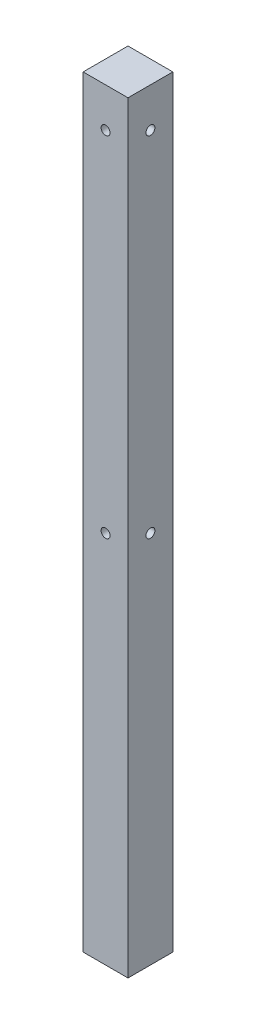
ISO-10303-21;
HEADER;
FILE_DESCRIPTION(('STEP AP214'),'2;1');
FILE_NAME('part.step','',(''),(''),'','','');
FILE_SCHEMA(('AUTOMOTIVE_DESIGN { 1 0 10303 214 1 1 1 1 }'));
ENDSEC;
DATA;
#1=APPLICATION_CONTEXT('core data for automotive mechanical design processes');
#2=APPLICATION_PROTOCOL_DEFINITION('international standard','automotive_design',2000,#1);
#3=PRODUCT_CONTEXT('',#1,'mechanical');
#4=PRODUCT('Part','Part','',(#3));
#5=PRODUCT_RELATED_PRODUCT_CATEGORY('part','',(#4));
#6=PRODUCT_DEFINITION_FORMATION('','',#4);
#7=PRODUCT_DEFINITION_CONTEXT('part definition',#1,'design');
#8=PRODUCT_DEFINITION('design','',#6,#7);
#9=PRODUCT_DEFINITION_SHAPE('','',#8);
#10=(LENGTH_UNIT() NAMED_UNIT(*) SI_UNIT(.MILLI.,.METRE.));
#11=(NAMED_UNIT(*) PLANE_ANGLE_UNIT() SI_UNIT($,.RADIAN.));
#12=(NAMED_UNIT(*) SI_UNIT($,.STERADIAN.) SOLID_ANGLE_UNIT());
#13=UNCERTAINTY_MEASURE_WITH_UNIT(LENGTH_MEASURE(1.E-05),#10,'distance_accuracy_value','');
#14=(GEOMETRIC_REPRESENTATION_CONTEXT(3) GLOBAL_UNCERTAINTY_ASSIGNED_CONTEXT((#13)) GLOBAL_UNIT_ASSIGNED_CONTEXT((#10,
#11,#12)) REPRESENTATION_CONTEXT('',''));
#15=CARTESIAN_POINT('',(0.,0.,0.));
#16=DIRECTION('',(0.,0.,1.));
#17=DIRECTION('',(1.,0.,0.));
#18=AXIS2_PLACEMENT_3D('',#15,#16,#17);
#19=CARTESIAN_POINT('',(50.,834.25,0.));
#20=DIRECTION('',(1.,0.,0.));
#21=DIRECTION('',(0.,0.,-1.));
#22=AXIS2_PLACEMENT_3D('',#19,#20,#21);
#23=CYLINDRICAL_SURFACE('',#22,10.);
#24=CARTESIAN_POINT('',(50.,834.25,0.));
#25=DIRECTION('',(1.,0.,0.));
#26=DIRECTION('',(0.,0.,-1.));
#27=AXIS2_PLACEMENT_3D('',#24,#25,#26);
#28=CIRCLE('',#27,10.);
#29=CARTESIAN_POINT('',(50.,834.25,-10.));
#30=VERTEX_POINT('',#29);
#31=EDGE_CURVE('E120',#30,#30,#28,.T.);
#32=ORIENTED_EDGE('',*,*,#31,.T.);
#33=EDGE_LOOP('',(#32));
#34=FACE_BOUND('',#33,.T.);
#35=CARTESIAN_POINT('',(0.,834.25,0.));
#36=DIRECTION('',(0.707106781186547,0.,-0.707106781186548));
#37=DIRECTION('',(0.707106781186548,0.,0.707106781186547));
#38=AXIS2_PLACEMENT_3D('',#35,#36,#37);
#39=ELLIPSE('',#38,14.1421356237309,9.99999999999999);
#40=CARTESIAN_POINT('',(0.,824.25,0.));
#41=VERTEX_POINT('',#40);
#42=CARTESIAN_POINT('',(0.,844.25,0.));
#43=VERTEX_POINT('',#42);
#44=EDGE_CURVE('E52',#41,#43,#39,.F.);
#45=ORIENTED_EDGE('',*,*,#44,.T.);
#46=CARTESIAN_POINT('',(0.,834.25,0.));
#47=DIRECTION('',(0.707106781186548,0.,0.707106781186547));
#48=DIRECTION('',(0.707106781186547,0.,-0.707106781186548));
#49=AXIS2_PLACEMENT_3D('',#46,#47,#48);
#50=ELLIPSE('',#49,14.1421356237309,9.99999999999999);
#51=EDGE_CURVE('E11',#43,#41,#50,.F.);
#52=ORIENTED_EDGE('',*,*,#51,.T.);
#53=EDGE_LOOP('',(#45,#52));
#54=FACE_BOUND('',#53,.T.);
#55=ADVANCED_FACE('F38',(#34,#54),#23,.F.);
#56=CARTESIAN_POINT('',(50.,1700.,-50.));
#57=DIRECTION('',(-1.,0.,0.));
#58=DIRECTION('',(0.,0.,1.));
#59=AXIS2_PLACEMENT_3D('',#56,#57,#58);
#60=PLANE('',#59);
#61=ORIENTED_EDGE('',*,*,#31,.F.);
#62=EDGE_LOOP('',(#61));
#63=FACE_BOUND('',#62,.T.);
#64=CARTESIAN_POINT('',(50.,1612.27548360223,0.));
#65=DIRECTION('',(1.,0.,0.));
#66=DIRECTION('',(0.,0.,-1.));
#67=AXIS2_PLACEMENT_3D('',#64,#65,#66);
#68=CIRCLE('',#67,10.);
#69=CARTESIAN_POINT('',(50.,1612.27548360223,-10.));
#70=VERTEX_POINT('',#69);
#71=EDGE_CURVE('E155',#70,#70,#68,.T.);
#72=ORIENTED_EDGE('',*,*,#71,.F.);
#73=EDGE_LOOP('',(#72));
#74=FACE_BOUND('',#73,.T.);
#75=DIRECTION('',(0.,0.,-1.));
#76=VECTOR('',#75,1.);
#77=CARTESIAN_POINT('',(50.,0.,-50.));
#78=LINE('',#77,#76);
#79=CARTESIAN_POINT('',(50.,0.,50.));
#80=VERTEX_POINT('',#79);
#81=CARTESIAN_POINT('',(50.,0.,-50.));
#82=VERTEX_POINT('',#81);
#83=EDGE_CURVE('E167',#80,#82,#78,.T.);
#84=ORIENTED_EDGE('',*,*,#83,.T.);
#85=DIRECTION('',(0.,-1.,0.));
#86=VECTOR('',#85,1.);
#87=CARTESIAN_POINT('',(50.,1700.,-50.));
#88=LINE('',#87,#86);
#89=CARTESIAN_POINT('',(50.,1700.,-50.));
#90=VERTEX_POINT('',#89);
#91=EDGE_CURVE('E105',#90,#82,#88,.T.);
#92=ORIENTED_EDGE('',*,*,#91,.F.);
#93=DIRECTION('',(0.,0.,-1.));
#94=VECTOR('',#93,1.);
#95=CARTESIAN_POINT('',(50.,1700.,-50.));
#96=LINE('',#95,#94);
#97=CARTESIAN_POINT('',(50.,1700.,50.));
#98=VERTEX_POINT('',#97);
#99=EDGE_CURVE('E168',#98,#90,#96,.T.);
#100=ORIENTED_EDGE('',*,*,#99,.F.);
#101=DIRECTION('',(0.,-1.,0.));
#102=VECTOR('',#101,1.);
#103=CARTESIAN_POINT('',(50.,1700.,50.));
#104=LINE('',#103,#102);
#105=EDGE_CURVE('E178',#98,#80,#104,.T.);
#106=ORIENTED_EDGE('',*,*,#105,.T.);
#107=EDGE_LOOP('',(#84,#92,#100,#106));
#108=FACE_BOUND('',#107,.T.);
#109=ADVANCED_FACE('F40',(#63,#74,#108),#60,.F.);
#110=CARTESIAN_POINT('',(-50.,1700.,-50.));
#111=DIRECTION('',(0.,0.,1.));
#112=DIRECTION('',(1.,0.,0.));
#113=AXIS2_PLACEMENT_3D('',#110,#111,#112);
#114=PLANE('',#113);
#115=CARTESIAN_POINT('',(0.,834.25,-50.));
#116=DIRECTION('',(0.,0.,1.));
#117=DIRECTION('',(1.,0.,0.));
#118=AXIS2_PLACEMENT_3D('',#115,#116,#117);
#119=CIRCLE('',#118,9.99999999999998);
#120=CARTESIAN_POINT('',(9.99999999999998,834.25,-50.));
#121=VERTEX_POINT('',#120);
#122=EDGE_CURVE('E227',#121,#121,#119,.T.);
#123=ORIENTED_EDGE('',*,*,#122,.T.);
#124=EDGE_LOOP('',(#123));
#125=FACE_BOUND('',#124,.T.);
#126=CARTESIAN_POINT('',(0.,1612.28,-50.));
#127=DIRECTION('',(0.,0.,1.));
#128=DIRECTION('',(1.,0.,0.));
#129=AXIS2_PLACEMENT_3D('',#126,#127,#128);
#130=CIRCLE('',#129,9.99999999999998);
#131=CARTESIAN_POINT('',(9.99999999999998,1612.28,-50.));
#132=VERTEX_POINT('',#131);
#133=EDGE_CURVE('E121',#132,#132,#130,.T.);
#134=ORIENTED_EDGE('',*,*,#133,.T.);
#135=EDGE_LOOP('',(#134));
#136=FACE_BOUND('',#135,.T.);
#137=DIRECTION('',(-1.,0.,0.));
#138=VECTOR('',#137,1.);
#139=CARTESIAN_POINT('',(-50.,0.,-50.));
#140=LINE('',#139,#138);
#141=CARTESIAN_POINT('',(-50.,0.,-50.));
#142=VERTEX_POINT('',#141);
#143=EDGE_CURVE('E182',#82,#142,#140,.T.);
#144=ORIENTED_EDGE('',*,*,#143,.T.);
#145=DIRECTION('',(0.,-1.,0.));
#146=VECTOR('',#145,1.);
#147=CARTESIAN_POINT('',(-50.,1700.,-50.));
#148=LINE('',#147,#146);
#149=CARTESIAN_POINT('',(-50.,1700.,-50.));
#150=VERTEX_POINT('',#149);
#151=EDGE_CURVE('E194',#150,#142,#148,.T.);
#152=ORIENTED_EDGE('',*,*,#151,.F.);
#153=DIRECTION('',(-1.,0.,0.));
#154=VECTOR('',#153,1.);
#155=CARTESIAN_POINT('',(-50.,1700.,-50.));
#156=LINE('',#155,#154);
#157=EDGE_CURVE('E90',#90,#150,#156,.T.);
#158=ORIENTED_EDGE('',*,*,#157,.F.);
#159=ORIENTED_EDGE('',*,*,#91,.T.);
#160=EDGE_LOOP('',(#144,#152,#158,#159));
#161=FACE_BOUND('',#160,.T.);
#162=ADVANCED_FACE('F146',(#125,#136,#161),#114,.F.);
#163=CARTESIAN_POINT('',(-50.,1700.,-50.));
#164=DIRECTION('',(1.,0.,0.));
#165=DIRECTION('',(0.,0.,-1.));
#166=AXIS2_PLACEMENT_3D('',#163,#164,#165);
#167=PLANE('',#166);
#168=CARTESIAN_POINT('',(-50.,834.25,0.));
#169=DIRECTION('',(1.,0.,0.));
#170=DIRECTION('',(0.,0.,-1.));
#171=AXIS2_PLACEMENT_3D('',#168,#169,#170);
#172=CIRCLE('',#171,10.);
#173=CARTESIAN_POINT('',(-50.,834.25,-10.));
#174=VERTEX_POINT('',#173);
#175=EDGE_CURVE('E151',#174,#174,#172,.T.);
#176=ORIENTED_EDGE('',*,*,#175,.T.);
#177=EDGE_LOOP('',(#176));
#178=FACE_BOUND('',#177,.T.);
#179=CARTESIAN_POINT('',(-50.,1612.27548360223,0.));
#180=DIRECTION('',(1.,0.,0.));
#181=DIRECTION('',(0.,0.,-1.));
#182=AXIS2_PLACEMENT_3D('',#179,#180,#181);
#183=CIRCLE('',#182,10.);
#184=CARTESIAN_POINT('',(-50.,1612.27548360223,-10.));
#185=VERTEX_POINT('',#184);
#186=EDGE_CURVE('E163',#185,#185,#183,.T.);
#187=ORIENTED_EDGE('',*,*,#186,.T.);
#188=EDGE_LOOP('',(#187));
#189=FACE_BOUND('',#188,.T.);
#190=DIRECTION('',(0.,0.,1.));
#191=VECTOR('',#190,1.);
#192=CARTESIAN_POINT('',(-50.,0.,-50.));
#193=LINE('',#192,#191);
#194=CARTESIAN_POINT('',(-50.,0.,50.));
#195=VERTEX_POINT('',#194);
#196=EDGE_CURVE('E185',#142,#195,#193,.T.);
#197=ORIENTED_EDGE('',*,*,#196,.T.);
#198=DIRECTION('',(0.,-1.,0.));
#199=VECTOR('',#198,1.);
#200=CARTESIAN_POINT('',(-50.,1700.,50.));
#201=LINE('',#200,#199);
#202=CARTESIAN_POINT('',(-50.,1700.,50.));
#203=VERTEX_POINT('',#202);
#204=EDGE_CURVE('E192',#203,#195,#201,.T.);
#205=ORIENTED_EDGE('',*,*,#204,.F.);
#206=DIRECTION('',(0.,0.,1.));
#207=VECTOR('',#206,1.);
#208=CARTESIAN_POINT('',(-50.,1700.,-50.));
#209=LINE('',#208,#207);
#210=EDGE_CURVE('E173',#150,#203,#209,.T.);
#211=ORIENTED_EDGE('',*,*,#210,.F.);
#212=ORIENTED_EDGE('',*,*,#151,.T.);
#213=EDGE_LOOP('',(#197,#205,#211,#212));
#214=FACE_BOUND('',#213,.T.);
#215=ADVANCED_FACE('F207',(#178,#189,#214),#167,.F.);
#216=CARTESIAN_POINT('',(-50.,1700.,50.));
#217=DIRECTION('',(0.,0.,-1.));
#218=DIRECTION('',(-1.,0.,0.));
#219=AXIS2_PLACEMENT_3D('',#216,#217,#218);
#220=PLANE('',#219);
#221=CARTESIAN_POINT('',(0.,834.25,50.));
#222=DIRECTION('',(0.,0.,1.));
#223=DIRECTION('',(1.,0.,0.));
#224=AXIS2_PLACEMENT_3D('',#221,#222,#223);
#225=CIRCLE('',#224,9.99999999999999);
#226=CARTESIAN_POINT('',(9.99999999999999,834.25,50.));
#227=VERTEX_POINT('',#226);
#228=EDGE_CURVE('E237',#227,#227,#225,.T.);
#229=ORIENTED_EDGE('',*,*,#228,.F.);
#230=EDGE_LOOP('',(#229));
#231=FACE_BOUND('',#230,.T.);
#232=CARTESIAN_POINT('',(0.,1612.28,50.));
#233=DIRECTION('',(0.,0.,1.));
#234=DIRECTION('',(1.,0.,0.));
#235=AXIS2_PLACEMENT_3D('',#232,#233,#234);
#236=CIRCLE('',#235,9.99999999999999);
#237=CARTESIAN_POINT('',(9.99999999999999,1612.28,50.));
#238=VERTEX_POINT('',#237);
#239=EDGE_CURVE('E232',#238,#238,#236,.T.);
#240=ORIENTED_EDGE('',*,*,#239,.F.);
#241=EDGE_LOOP('',(#240));
#242=FACE_BOUND('',#241,.T.);
#243=DIRECTION('',(1.,0.,0.));
#244=VECTOR('',#243,1.);
#245=CARTESIAN_POINT('',(-50.,0.,50.));
#246=LINE('',#245,#244);
#247=EDGE_CURVE('E82',#195,#80,#246,.T.);
#248=ORIENTED_EDGE('',*,*,#247,.T.);
#249=ORIENTED_EDGE('',*,*,#105,.F.);
#250=DIRECTION('',(1.,0.,0.));
#251=VECTOR('',#250,1.);
#252=CARTESIAN_POINT('',(-50.,1700.,50.));
#253=LINE('',#252,#251);
#254=EDGE_CURVE('E61',#203,#98,#253,.T.);
#255=ORIENTED_EDGE('',*,*,#254,.F.);
#256=ORIENTED_EDGE('',*,*,#204,.T.);
#257=EDGE_LOOP('',(#248,#249,#255,#256));
#258=FACE_BOUND('',#257,.T.);
#259=ADVANCED_FACE('F208',(#231,#242,#258),#220,.F.);
#260=CARTESIAN_POINT('',(0.,1700.,0.));
#261=DIRECTION('',(0.,1.,0.));
#262=DIRECTION('',(0.,0.,1.));
#263=AXIS2_PLACEMENT_3D('',#260,#261,#262);
#264=PLANE('',#263);
#265=ORIENTED_EDGE('',*,*,#99,.T.);
#266=ORIENTED_EDGE('',*,*,#157,.T.);
#267=ORIENTED_EDGE('',*,*,#210,.T.);
#268=ORIENTED_EDGE('',*,*,#254,.T.);
#269=EDGE_LOOP('',(#265,#266,#267,#268));
#270=FACE_BOUND('',#269,.T.);
#271=ADVANCED_FACE('F209',(#270),#264,.T.);
#272=CARTESIAN_POINT('',(0.,0.,0.));
#273=DIRECTION('',(0.,1.,0.));
#274=DIRECTION('',(0.,0.,1.));
#275=AXIS2_PLACEMENT_3D('',#272,#273,#274);
#276=PLANE('',#275);
#277=ORIENTED_EDGE('',*,*,#83,.F.);
#278=ORIENTED_EDGE('',*,*,#247,.F.);
#279=ORIENTED_EDGE('',*,*,#196,.F.);
#280=ORIENTED_EDGE('',*,*,#143,.F.);
#281=EDGE_LOOP('',(#277,#278,#279,#280));
#282=FACE_BOUND('',#281,.T.);
#283=ADVANCED_FACE('F137',(#282),#276,.F.);
#284=CARTESIAN_POINT('',(50.,1612.27548360223,0.));
#285=DIRECTION('',(1.,0.,0.));
#286=DIRECTION('',(0.,0.,-1.));
#287=AXIS2_PLACEMENT_3D('',#284,#285,#286);
#288=CYLINDRICAL_SURFACE('',#287,10.);
#289=CARTESIAN_POINT('',(-9.99999898010749,1612.27548360223,-10.));
#290=CARTESIAN_POINT('',(-10.0000976262313,1612.49846189064,-9.99999794013743));
#291=CARTESIAN_POINT('',(-9.99272659014063,1612.72147800719,-9.99252618315263));
#292=CARTESIAN_POINT('',(-9.96319930527727,1613.16555690865,-9.96279699343112));
#293=CARTESIAN_POINT('',(-9.94103997156247,1613.38661927624,-9.94053647566002));
#294=CARTESIAN_POINT('',(-9.88239130180325,1613.82509198013,-9.88168441724928));
#295=CARTESIAN_POINT('',(-9.84588935796274,1614.04249892732,-9.84508026799295));
#296=CARTESIAN_POINT('',(-9.75930246880813,1614.47179664017,-9.75828751120326));
#297=CARTESIAN_POINT('',(-9.70921788194251,1614.68368755123,-9.7080992621569));
#298=CARTESIAN_POINT('',(-9.59679719660233,1615.09912624717,-9.59546992605019));
#299=CARTESIAN_POINT('',(-9.53454955789336,1615.30272215291,-9.53311731317229));
#300=CARTESIAN_POINT('',(-9.39858242327569,1615.70216057657,-9.39693747832633));
#301=CARTESIAN_POINT('',(-9.32485861899744,1615.89800014785,-9.32310594696796));
#302=CARTESIAN_POINT('',(-9.16702899669798,1616.2810609764,-9.16505737869574));
#303=CARTESIAN_POINT('',(-9.08292441163676,1616.46828325356,-9.0808415751577));
#304=CARTESIAN_POINT('',(-8.90536571570071,1616.8336512179,-8.90305599741039));
#305=CARTESIAN_POINT('',(-8.81190942608959,1617.01179477529,-8.80948404343291));
#306=CARTESIAN_POINT('',(-8.57672115449208,1617.42960891938,-8.57401049506819));
#307=CARTESIAN_POINT('',(-8.43087296801772,1617.66465869959,-8.42798997281269));
#308=CARTESIAN_POINT('',(-8.12520554019687,1618.11569176011,-8.12196325116366));
#309=CARTESIAN_POINT('',(-7.96538497984856,1618.33167323649,-7.96195573138801));
#310=CARTESIAN_POINT('',(-7.63362996184256,1618.74514477614,-7.62980689666286));
#311=CARTESIAN_POINT('',(-7.46166965268203,1618.94259315647,-7.45763968738279));
#312=CARTESIAN_POINT('',(-7.1078863681561,1619.31879499788,-7.10341650293182));
#313=CARTESIAN_POINT('',(-6.92606337313864,1619.49754842171,-6.92136050805685));
#314=CARTESIAN_POINT('',(-6.48219548609604,1619.90253540879,-6.47689474013113));
#315=CARTESIAN_POINT('',(-6.21632599750444,1620.1203873417,-6.21064422051454));
#316=CARTESIAN_POINT('',(-5.67222173105225,1620.52259848029,-5.66567410042851));
#317=CARTESIAN_POINT('',(-5.39398115613774,1620.7069417736,-5.38694865383075));
#318=CARTESIAN_POINT('',(-4.82830370696799,1621.04331396219,-4.82013095297611));
#319=CARTESIAN_POINT('',(-4.54087437268702,1621.19536860715,-4.53204637549684));
#320=CARTESIAN_POINT('',(-3.95907397006877,1621.46852263777,-3.94863654080369));
#321=CARTESIAN_POINT('',(-3.66470616059586,1621.5896362514,-3.65331468030931));
#322=CARTESIAN_POINT('',(-3.19058993886652,1621.75921813269,-3.17718250685674));
#323=CARTESIAN_POINT('',(-3.01242259348861,1621.81729971615,-2.99815141821699));
#324=CARTESIAN_POINT('',(-2.65489416100799,1621.92293805164,-2.63850497469348));
#325=CARTESIAN_POINT('',(-2.4755342555538,1621.97050397338,-2.4578911440147));
#326=CARTESIAN_POINT('',(-2.01860406285901,1622.07828022694,-1.99692163906074));
#327=CARTESIAN_POINT('',(-1.74042530447089,1622.13139816118,-1.71549592179029));
#328=CARTESIAN_POINT('',(-1.27003976504966,1622.20092299369,-1.23503528762237));
#329=CARTESIAN_POINT('',(-1.07759452180368,1622.22359078185,-1.03716319502614));
#330=CARTESIAN_POINT('',(-0.777707315706295,1622.25032830782,-0.718652779837108));
#331=CARTESIAN_POINT('',(-0.668232008471103,1622.25821195121,-0.600156335958622));
#332=CARTESIAN_POINT('',(-0.5045256733269,1622.26743235312,-0.40732126508171));
#333=CARTESIAN_POINT('',(-0.446999986192739,1622.27012505736,-0.336227608652713));
#334=CARTESIAN_POINT('',(-0.382349562133267,1622.27269996116,-0.236995791411632));
#335=CARTESIAN_POINT('',(-0.368163303243749,1622.27322908345,-0.213683879316501));
#336=CARTESIAN_POINT('',(-0.342480250799768,1622.2741415731,-0.165590387121098));
#337=CARTESIAN_POINT('',(-0.330978679941623,1622.27452520013,-0.140811517491331));
#338=CARTESIAN_POINT('',(-0.315533077710255,1622.27502278996,-0.0975862630469684));
#339=CARTESIAN_POINT('',(-0.310349776656142,1622.27518362162,-0.0796005428850992));
#340=CARTESIAN_POINT('',(-0.303054495672547,1622.27540754589,-0.0430426481303628));
#341=CARTESIAN_POINT('',(-0.300931818517807,1622.27547097895,-0.0244727490578558));
#342=CARTESIAN_POINT('',(-0.300205103632165,1622.27549283978,0.0128350455574307));
#343=CARTESIAN_POINT('',(-0.301618926177544,1622.27545073454,0.0315733156969989));
#344=CARTESIAN_POINT('',(-0.307681650307432,1622.27526593112,0.0685341168406336));
#345=CARTESIAN_POINT('',(-0.312339174277956,1622.27512296482,0.0867551382292879));
#346=CARTESIAN_POINT('',(-0.330226423679226,1622.27455282091,0.14132713099595));
#347=CARTESIAN_POINT('',(-0.347304514003391,1622.27398508943,0.176345156634737));
#348=CARTESIAN_POINT('',(-0.386000914119675,1622.27256697517,0.243876461094534));
#349=CARTESIAN_POINT('',(-0.407661303739916,1622.27171392689,0.276362416057307));
#350=CARTESIAN_POINT('',(-0.479584403526916,1622.26861279862,0.377026305142638));
#351=CARTESIAN_POINT('',(-0.533632241502456,1622.26590105046,0.442441471468532));
#352=CARTESIAN_POINT('',(-0.644385525613811,1622.25937567054,0.570948416913729));
#353=CARTESIAN_POINT('',(-0.701096651157631,1622.25555958526,0.634034666065601));
#354=CARTESIAN_POINT('',(-0.815623950613769,1622.24684645673,0.758835860242758));
#355=CARTESIAN_POINT('',(-0.873436596559627,1622.24195246172,0.820554142600376));
#356=CARTESIAN_POINT('',(-0.989588148243909,1622.2310869539,0.943259578966304));
#357=CARTESIAN_POINT('',(-1.047926454643,1622.22511654932,1.00424741677271));
#358=CARTESIAN_POINT('',(-1.34049086181197,1622.19253934096,1.3084546681925));
#359=CARTESIAN_POINT('',(-1.57677676729038,1622.15780572178,1.54888879699003));
#360=CARTESIAN_POINT('',(-2.04881458072232,1622.07082635501,2.02735292584259));
#361=CARTESIAN_POINT('',(-2.28456604711146,1622.01856935082,2.26538127897832));
#362=CARTESIAN_POINT('',(-2.75474046965051,1621.89615590566,2.73910416561247));
#363=CARTESIAN_POINT('',(-2.98915997987742,1621.82596508381,2.97479330276211));
#364=CARTESIAN_POINT('',(-3.45508765041959,1621.66738307423,3.442854538514));
#365=CARTESIAN_POINT('',(-3.6865960425948,1621.57899334585,3.67522690148696));
#366=CARTESIAN_POINT('',(-4.2180867074266,1621.3527828871,4.20843204456885));
#367=CARTESIAN_POINT('',(-4.51668870182465,1621.2081600997,4.50779473567366));
#368=CARTESIAN_POINT('',(-5.10495915239884,1620.88534760951,5.09737432304827));
#369=CARTESIAN_POINT('',(-5.39462442907102,1620.70714611677,5.38758796505439));
#370=CARTESIAN_POINT('',(-5.96157341823173,1620.31604830854,5.9555037920929));
#371=CARTESIAN_POINT('',(-6.23887587965501,1620.10320697655,6.23322492890681));
#372=CARTESIAN_POINT('',(-6.7778734042662,1619.6411348992,6.7729799836624));
#373=CARTESIAN_POINT('',(-7.03957861400702,1619.39192818288,7.03502410048182));
#374=CARTESIAN_POINT('',(-7.447999978436,1618.95680902953,7.44395283208073));
#375=CARTESIAN_POINT('',(-7.60088569894206,1618.78243206285,7.59702311774558));
#376=CARTESIAN_POINT('',(-7.89758136950345,1618.41867226101,7.89407209398891));
#377=CARTESIAN_POINT('',(-8.0413893635554,1618.22928621149,8.03804882515728));
#378=CARTESIAN_POINT('',(-8.31819326574946,1617.83567168758,8.31517771730908));
#379=CARTESIAN_POINT('',(-8.45120076104004,1617.63145957696,8.44834147881699));
#380=CARTESIAN_POINT('',(-8.70478005071714,1617.2082448175,8.70222373304095));
#381=CARTESIAN_POINT('',(-8.82535917551048,1616.9892510147,8.82294956178477));
#382=CARTESIAN_POINT('',(-9.03195880469565,1616.57731515247,9.02980977550291));
#383=CARTESIAN_POINT('',(-9.12030516891076,1616.38670620783,9.11827120280942));
#384=CARTESIAN_POINT('',(-9.28619480862073,1615.99638516328,9.28438705793998));
#385=CARTESIAN_POINT('',(-9.36374333754312,1615.79667755333,9.36204674107351));
#386=CARTESIAN_POINT('',(-9.50691793527382,1615.38888982838,9.50544065111092));
#387=CARTESIAN_POINT('',(-9.57254571311982,1615.18081091877,9.57117658748008));
#388=CARTESIAN_POINT('',(-9.69077415874732,1614.75734001943,9.68961912347007));
#389=CARTESIAN_POINT('',(-9.74337472258719,1614.54194797136,9.74232561913152));
#390=CARTESIAN_POINT('',(-9.83487435290641,1614.10365672146,9.83403631069547));
#391=CARTESIAN_POINT('',(-9.87366943255299,1613.88071384656,9.87293650807316));
#392=CARTESIAN_POINT('',(-9.93618177528338,1613.4306122198,9.93565806482951));
#393=CARTESIAN_POINT('',(-9.95989897438512,1613.20345345004,9.95947936022176));
#394=CARTESIAN_POINT('',(-9.99170534241536,1612.74704474546,9.99149337418261));
#395=CARTESIAN_POINT('',(-9.99980142826941,1612.51779578136,9.99969300989846));
#396=CARTESIAN_POINT('',(-10.0001912850112,1612.0592767474,10.0002899529583));
#397=CARTESIAN_POINT('',(-9.99248659612656,1611.83000668177,9.99268880053026));
#398=CARTESIAN_POINT('',(-9.96331764763798,1611.40085270239,9.96371501100188));
#399=CARTESIAN_POINT('',(-9.94360474420379,1611.20072640085,9.94409367767468));
#400=CARTESIAN_POINT('',(-9.89241540177043,1610.80343620806,9.89308823794108));
#401=CARTESIAN_POINT('',(-9.86093514652222,1610.60627329946,9.86170031552349));
#402=CARTESIAN_POINT('',(-9.78675158362025,1610.21629360291,9.78770250475261));
#403=CARTESIAN_POINT('',(-9.7440518175343,1610.02347546431,9.74509615761541));
#404=CARTESIAN_POINT('',(-9.64807232934185,1609.64310844002,9.64930509095488));
#405=CARTESIAN_POINT('',(-9.59478841021848,1609.45556167842,9.59611617502915));
#406=CARTESIAN_POINT('',(-9.47634220157274,1609.08015220424,9.4778654097417));
#407=CARTESIAN_POINT('',(-9.41082689822712,1608.89251220425,9.41245062008271));
#408=CARTESIAN_POINT('',(-9.27015225784029,1608.52458797839,9.2719798327068));
#409=CARTESIAN_POINT('',(-9.19498983478881,1608.34430613075,9.19692074987543));
#410=CARTESIAN_POINT('',(-8.95634508373009,1607.81532180425,8.95859132443324));
#411=CARTESIAN_POINT('',(-8.77965647541379,1607.47832929096,8.78212008363375));
#412=CARTESIAN_POINT('',(-8.44239554179759,1606.91268668253,8.44526213721896));
#413=CARTESIAN_POINT('',(-8.2875682785034,1606.67702047312,8.29061618684285));
#414=CARTESIAN_POINT('',(-7.96386119885567,1606.22574829809,7.96728875931998));
#415=CARTESIAN_POINT('',(-7.79497912766116,1606.01014556309,7.7986050300644));
#416=CARTESIAN_POINT('',(-7.44506553712989,1605.59836651861,7.44911139163631));
#417=CARTESIAN_POINT('',(-7.26400360127196,1605.40224211989,7.26827112503926));
#418=CARTESIAN_POINT('',(-6.89209397706146,1605.02959800866,6.89683567352615));
#419=CARTESIAN_POINT('',(-6.70124648299855,1604.85307790712,6.70624068228772));
#420=CARTESIAN_POINT('',(-6.23639673381204,1604.45480253995,6.2420430895615));
#421=CARTESIAN_POINT('',(-5.95864028448772,1604.24175663634,5.96470554041767));
#422=CARTESIAN_POINT('',(-5.39098777874865,1603.8505190864,5.39801749366647));
#423=CARTESIAN_POINT('',(-5.1010859330967,1603.67234429663,5.10866126780038));
#424=CARTESIAN_POINT('',(-4.51244534009281,1603.34969639509,4.52133019330866));
#425=CARTESIAN_POINT('',(-4.21371936943252,1603.20517701205,4.22336781843389));
#426=CARTESIAN_POINT('',(-3.6093891910763,1602.94833031627,3.62095944184495));
#427=CARTESIAN_POINT('',(-3.30378844675537,1602.83598716884,3.31651670878845));
#428=CARTESIAN_POINT('',(-2.83293356937604,1602.68815304994,2.84813442614206));
#429=CARTESIAN_POINT('',(-2.6695660359803,1602.64142542465,2.68574918934028));
#430=CARTESIAN_POINT('',(-2.34145444140422,1602.5565066646,2.36004428910267));
#431=CARTESIAN_POINT('',(-2.17671008227217,1602.51831742996,2.19672442595338));
#432=CARTESIAN_POINT('',(-1.88186842571719,1602.45777873915,1.90519444907107));
#433=CARTESIAN_POINT('',(-1.75202149121331,1602.43379056885,1.7770668908385));
#434=CARTESIAN_POINT('',(-1.49179935367538,1602.39102191311,1.52123875350964));
#435=CARTESIAN_POINT('',(-1.3614267899981,1602.37222646642,1.39353801753157));
#436=CARTESIAN_POINT('',(-1.1451870559631,1602.34541890019,1.1835443481069));
#437=CARTESIAN_POINT('',(-1.05972712320779,1602.33593574398,1.10101471080627));
#438=CARTESIAN_POINT('',(-0.887034665432671,1602.31903676075,0.93599166272438));
#439=CARTESIAN_POINT('',(-0.799793073011311,1602.31164067725,0.853505516149334));
#440=CARTESIAN_POINT('',(-0.66679609577937,1602.30215550139,0.731051561337179));
#441=CARTESIAN_POINT('',(-0.621868821897721,1602.2992511089,0.690237366501271));
#442=CARTESIAN_POINT('',(-0.530778614646921,1602.29399141888,0.609464771903338));
#443=CARTESIAN_POINT('',(-0.484610762195775,1602.29163884048,0.569511456145537));
#444=CARTESIAN_POINT('',(-0.39129737953422,1602.2875507373,0.492608384630434));
#445=CARTESIAN_POINT('',(-0.34418384331868,1602.28580498178,0.45561784633972));
#446=CARTESIAN_POINT('',(-0.246313377859504,1602.28291410021,0.386855669777941));
#447=CARTESIAN_POINT('',(-0.195601699936697,1602.28176264185,0.355031596307034));
#448=CARTESIAN_POINT('',(-0.130029381683837,1602.28083968234,0.327292066360918));
#449=CARTESIAN_POINT('',(-0.118932246904419,1602.28070103509,0.32301343261752));
#450=CARTESIAN_POINT('',(-0.0964169231301864,1602.28045838007,0.31541006559586));
#451=CARTESIAN_POINT('',(-0.0849986560181496,1602.28035438081,0.312085566658807));
#452=CARTESIAN_POINT('',(-0.0505538672441254,1602.28010195769,0.303938994783873));
#453=CARTESIAN_POINT('',(-0.0270681230938875,1602.28000914857,0.300819166693194));
#454=CARTESIAN_POINT('',(0.0163924674815784,1602.2799934067,0.300290551954016));
#455=CARTESIAN_POINT('',(0.0363606578526443,1602.2800468873,0.302088802735881));
#456=CARTESIAN_POINT('',(0.075743233039318,1602.28026729643,0.309296415830664));
#457=CARTESIAN_POINT('',(0.095152350337865,1602.28043507161,0.314732721528388));
#458=CARTESIAN_POINT('',(0.154323048880429,1602.28110926361,0.335663034437154));
#459=CARTESIAN_POINT('',(0.192413959605159,1602.28178430762,0.355591395683952));
#460=CARTESIAN_POINT('',(0.265766396185627,1602.28346461193,0.400097028042301));
#461=CARTESIAN_POINT('',(0.301003762506442,1602.28447238561,0.424709060128776));
#462=CARTESIAN_POINT('',(0.411441332337627,1602.28817712498,0.506803364386609));
#463=CARTESIAN_POINT('',(0.483691858622577,1602.29144725114,0.568192651458751));
#464=CARTESIAN_POINT('',(0.625903139030583,1602.29935650477,0.693502856119578));
#465=CARTESIAN_POINT('',(0.695859066516355,1602.30399833513,0.757428554226694));
#466=CARTESIAN_POINT('',(0.834390844029621,1602.31462921491,0.886297723348133));
#467=CARTESIAN_POINT('',(0.902970101922903,1602.32061432686,0.951237713792392));
#468=CARTESIAN_POINT('',(1.03941477235458,1602.33393061604,1.0815881905224));
#469=CARTESIAN_POINT('',(1.10728075191473,1602.34126062249,1.14699822039883));
#470=CARTESIAN_POINT('',(1.44679507730305,1602.38142197951,1.47570639974943));
#471=CARTESIAN_POINT('',(1.71563126213154,1602.424481262,1.74075934203922));
#472=CARTESIAN_POINT('',(2.2503605156383,1602.53268963391,2.26962052301318));
#473=CARTESIAN_POINT('',(2.51625152837471,1602.59785325966,2.53342782648594));
#474=CARTESIAN_POINT('',(3.04476725354704,1602.75082011912,3.05870162153385));
#475=CARTESIAN_POINT('',(3.30738574390949,1602.83866111848,3.32016344820291));
#476=CARTESIAN_POINT('',(3.82797449444239,1603.0374786197,3.83880429105766));
#477=CARTESIAN_POINT('',(4.08594563245672,1603.14845070146,4.09598411536537));
#478=CARTESIAN_POINT('',(4.59717239824727,1603.39479423766,4.6058513415177));
#479=CARTESIAN_POINT('',(4.85040210535581,1603.53027149747,4.85851382546095));
#480=CARTESIAN_POINT('',(5.3494703646167,1603.82616487124,5.35657840964704));
#481=CARTESIAN_POINT('',(5.59530788076613,1603.98658446156,5.60197949214076));
#482=CARTESIAN_POINT('',(6.07741944733245,1604.33311268407,6.08330494415167));
#483=CARTESIAN_POINT('',(6.31370321244309,1604.51919432671,6.31923893828376));
#484=CARTESIAN_POINT('',(6.77463759729391,1604.91812949233,6.7795313719727));
#485=CARTESIAN_POINT('',(6.99929197895261,1605.13097428049,7.00389355473751));
#486=CARTESIAN_POINT('',(7.37719750157165,1605.52495009023,7.38132612585399));
#487=CARTESIAN_POINT('',(7.53374192799777,1605.69979134369,7.53768065231961));
#488=CARTESIAN_POINT('',(7.83761817377791,1606.06484665977,7.84119399976931));
#489=CARTESIAN_POINT('',(7.98495041151413,1606.25506002334,7.98835323836781));
#490=CARTESIAN_POINT('',(8.26870426943843,1606.65081154001,8.27177430194849));
#491=CARTESIAN_POINT('',(8.40513533514788,1606.85633612133,8.40804556101706));
#492=CARTESIAN_POINT('',(8.66541582959893,1607.28270984585,8.66801651930056));
#493=CARTESIAN_POINT('',(8.78926914745911,1607.5035542163,8.79172010452397));
#494=CARTESIAN_POINT('',(9.00052752582147,1607.91722000474,9.00271409260037));
#495=CARTESIAN_POINT('',(9.09040959934032,1608.10751626194,9.09248020187784));
#496=CARTESIAN_POINT('',(9.25940245162444,1608.49733460541,9.26124517433389));
#497=CARTESIAN_POINT('',(9.33851916502274,1608.69685152664,9.34024996994));
#498=CARTESIAN_POINT('',(9.48485484123432,1609.10440665069,9.48636491572725));
#499=CARTESIAN_POINT('',(9.55207589535073,1609.31244334776,9.55347715666854));
#500=CARTESIAN_POINT('',(9.67350091950435,1609.73600549706,9.67468686649785));
#501=CARTESIAN_POINT('',(9.72770478153502,1609.9515310114,9.72878422739853));
#502=CARTESIAN_POINT('',(9.82241789976435,1610.39032889165,9.82328518880193));
#503=CARTESIAN_POINT('',(9.86282007687772,1610.6136476446,9.86358172277398));
#504=CARTESIAN_POINT('',(9.92849396707008,1611.06470553216,9.92904540572685));
#505=CARTESIAN_POINT('',(9.95376561574313,1611.29244468558,9.95421249030633));
#506=CARTESIAN_POINT('',(9.98859289691375,1611.75020993365,9.98883123925756));
#507=CARTESIAN_POINT('',(9.99815572330232,1611.98023493292,9.99829009726926));
#508=CARTESIAN_POINT('',(10.0013593088221,1612.44048663145,10.0012858001352));
#509=CARTESIAN_POINT('',(9.99500168575601,1612.67071330785,9.99482426278768));
#510=CARTESIAN_POINT('',(9.96825768456143,1613.10132856536,9.96788464373423));
#511=CARTESIAN_POINT('',(9.9496681012405,1613.3019464104,9.94920340594554));
#512=CARTESIAN_POINT('',(9.90065416662742,1613.70032832082,9.90000542993158));
#513=CARTESIAN_POINT('',(9.8702259782527,1613.89809143937,9.86948485439576));
#514=CARTESIAN_POINT('',(9.7980630504078,1614.28936037857,9.79713609739403));
#515=CARTESIAN_POINT('',(9.75633184656948,1614.48286751008,9.75531145189858));
#516=CARTESIAN_POINT('',(9.66220100625149,1614.86467693947,9.66099218047381));
#517=CARTESIAN_POINT('',(9.60979730891967,1615.05297722508,9.60849349311589));
#518=CARTESIAN_POINT('',(9.4932849485877,1615.42920855097,9.49178614802944));
#519=CARTESIAN_POINT('',(9.42886196165815,1615.61694456929,9.42726310270735));
#520=CARTESIAN_POINT('',(9.29034561615923,1615.98516219615,9.28854387772996));
#521=CARTESIAN_POINT('',(9.21624855096713,1616.16564098923,9.21434399040507));
#522=CARTESIAN_POINT('',(8.98076266548767,1616.69531677538,8.97854446511593));
#523=CARTESIAN_POINT('',(8.80612627057705,1617.03292014725,8.80369199431156));
#524=CARTESIAN_POINT('',(8.47283313341767,1617.59907109659,8.46999911829092));
#525=CARTESIAN_POINT('',(8.31999801371346,1617.83465305788,8.31698458084809));
#526=CARTESIAN_POINT('',(8.00029291725649,1618.28597425687,7.99690413136968));
#527=CARTESIAN_POINT('',(7.83342105369171,1618.50171081877,7.8298363303015));
#528=CARTESIAN_POINT('',(7.48754014607336,1618.91395519235,7.48354100095677));
#529=CARTESIAN_POINT('',(7.30850083636459,1619.11041184505,7.30428315003935));
#530=CARTESIAN_POINT('',(6.9406404706725,1619.48390224623,6.93595590052322));
#531=CARTESIAN_POINT('',(6.75181959573796,1619.66093635401,6.74688668352478));
#532=CARTESIAN_POINT('',(6.29174409137895,1620.06069745241,6.2861706754326));
#533=CARTESIAN_POINT('',(6.01673575632544,1620.27478206554,6.01075161513779));
#534=CARTESIAN_POINT('',(5.45462999763411,1620.66837293523,5.44770287471979));
#535=CARTESIAN_POINT('',(5.1675268165175,1620.84786249166,5.16006737869224));
#536=CARTESIAN_POINT('',(4.58458988789328,1621.17341523901,4.57585837745101));
#537=CARTESIAN_POINT('',(4.28876797722116,1621.31952158745,4.27929697968983));
#538=CARTESIAN_POINT('',(3.69054304140977,1621.57979671297,3.67922122923664));
#539=CARTESIAN_POINT('',(3.38814329589968,1621.69398102966,3.37571033767776));
#540=CARTESIAN_POINT('',(2.9189945788203,1621.8460534608,2.90419731703789));
#541=CARTESIAN_POINT('',(2.75381779209822,1621.89487970281,2.7380676838877));
#542=CARTESIAN_POINT('',(2.42247250362769,1621.98366110062,2.40439269787293));
#543=CARTESIAN_POINT('',(2.25630394416543,1622.02361573489,2.23684726237853));
#544=CARTESIAN_POINT('',(1.95939461349449,1622.08706796918,1.9367448452639));
#545=CARTESIAN_POINT('',(1.82875124578003,1622.11225623024,1.80444431883009));
#546=CARTESIAN_POINT('',(1.5677865351426,1622.15722197962,1.53925479431305));
#547=CARTESIAN_POINT('',(1.43746519364269,1622.17701267532,1.40636805607019));
#548=CARTESIAN_POINT('',(1.22190588281184,1622.20544266604,1.18480927380648));
#549=CARTESIAN_POINT('',(1.1364612669858,1622.21558261539,1.09652587938141));
#550=CARTESIAN_POINT('',(0.965654730591877,1622.23363829288,0.91829430896898));
#551=CARTESIAN_POINT('',(0.880298692627144,1622.24153598942,0.828338510979085));
#552=CARTESIAN_POINT('',(0.753525473878217,1622.25166126295,0.691371397743084));
#553=CARTESIAN_POINT('',(0.711294304586668,1622.25475928248,0.645168288203923));
#554=CARTESIAN_POINT('',(0.627652313526935,1622.26037093189,0.551575369410045));
#555=CARTESIAN_POINT('',(0.586245891023984,1622.26288194479,0.504181251442172));
#556=CARTESIAN_POINT('',(0.506249567203713,1622.26725710487,0.408338643827984));
#557=CARTESIAN_POINT('',(0.467627122188112,1622.26913025008,0.359916030412564));
#558=CARTESIAN_POINT('',(0.395356860817113,1622.27224258307,0.259504951449313));
#559=CARTESIAN_POINT('',(0.361663664147712,1622.27348785167,0.207556444435073));
#560=CARTESIAN_POINT('',(0.331409674171069,1622.27450851636,0.140091810300035));
#561=CARTESIAN_POINT('',(0.326637835797272,1622.27466497719,0.128484745264453));
#562=CARTESIAN_POINT('',(0.31809388222528,1622.2749403473,0.104910515455938));
#563=CARTESIAN_POINT('',(0.314321957924121,1622.2750592494,0.0929432824070001));
#564=CARTESIAN_POINT('',(0.304976615720161,1622.27535052416,0.056820037386542));
#565=CARTESIAN_POINT('',(0.301217397603075,1622.27546248205,0.0321261824873269));
#566=CARTESIAN_POINT('',(0.300104894718857,1622.27549577893,-0.0126624622612874));
#567=CARTESIAN_POINT('',(0.301664090191554,1622.2754494753,-0.0327337198409686));
#568=CARTESIAN_POINT('',(0.3084737434494,1622.27524165397,-0.0723517768218857));
#569=CARTESIAN_POINT('',(0.313752042272899,1622.27507926714,-0.0918934587089117));
#570=CARTESIAN_POINT('',(0.333868781880022,1622.27443352958,-0.150164030556088));
#571=CARTESIAN_POINT('',(0.35291542438158,1622.27379234227,-0.187345109391778));
#572=CARTESIAN_POINT('',(0.39562948059817,1622.2721947697,-0.25894955096559));
#573=CARTESIAN_POINT('',(0.419331537794952,1622.27123598182,-0.293349326331853));
#574=CARTESIAN_POINT('',(0.498162405252316,1622.26772834255,-0.400628055279612));
#575=CARTESIAN_POINT('',(0.557147503170751,1622.26464442025,-0.470623547595341));
#576=CARTESIAN_POINT('',(0.677686421020841,1622.25719882155,-0.608315749788842));
#577=CARTESIAN_POINT('',(0.739245263099107,1622.25283453647,-0.676007448392906));
#578=CARTESIAN_POINT('',(0.863418998286456,1622.24284873278,-0.810027906564201));
#579=CARTESIAN_POINT('',(0.926030625290491,1622.23723060914,-0.876359828105649));
#580=CARTESIAN_POINT('',(1.05174228979552,1622.22473950099,-1.00830547934148));
#581=CARTESIAN_POINT('',(1.11484183016607,1622.2178676648,-1.0739198084822));
#582=CARTESIAN_POINT('',(1.43175739989256,1622.1802629269,-1.40189699976444));
#583=CARTESIAN_POINT('',(1.68742838986159,1622.14001528146,-1.66146231551405));
#584=CARTESIAN_POINT('',(2.19777328148888,1622.0389859266,-2.17784502100443));
#585=CARTESIAN_POINT('',(2.4524464173677,1621.97819073857,-2.43466049254673));
#586=CARTESIAN_POINT('',(2.95969751547236,1621.83560623655,-2.94524559642714));
#587=CARTESIAN_POINT('',(3.21227225578698,1621.75378922189,-3.19901074391139));
#588=CARTESIAN_POINT('',(3.7136239376424,1621.56872558572,-3.70236597357711));
#589=CARTESIAN_POINT('',(3.96240158274716,1621.46548298719,-3.9519568300544));
#590=CARTESIAN_POINT('',(4.45587664877502,1621.23652882336,-4.4468276502803));
#591=CARTESIAN_POINT('',(4.70055601580514,1621.11073718692,-4.69208871351812));
#592=CARTESIAN_POINT('',(5.18351959492196,1620.8361846037,-5.17608052184446));
#593=CARTESIAN_POINT('',(5.42180307070386,1620.68742102556,-5.41481051512649));
#594=CARTESIAN_POINT('',(5.89014444625317,1620.36620936318,-5.88395525162491));
#595=CARTESIAN_POINT('',(6.12020751051161,1620.19377649109,-6.11437521651523));
#596=CARTESIAN_POINT('',(6.57026354082773,1619.82429403875,-6.56508513223576));
#597=CARTESIAN_POINT('',(6.79025888438313,1619.62725031178,-6.78537747476654));
#598=CARTESIAN_POINT('',(7.17244675695802,1619.25220808586,-7.16805877564221));
#599=CARTESIAN_POINT('',(7.33700320300804,1619.07903303778,-7.33281962145275));
#600=CARTESIAN_POINT('',(7.65700986695501,1618.71650896316,-7.65321515967618));
#601=CARTESIAN_POINT('',(7.81246025348703,1618.52716023631,-7.80885002109317));
#602=CARTESIAN_POINT('',(8.11249861307256,1618.13224822616,-8.10924189800836));
#603=CARTESIAN_POINT('',(8.25709581640237,1617.92669903301,-8.25400815692341));
#604=CARTESIAN_POINT('',(8.53368367450748,1617.4992902966,-8.53092240001597));
#605=CARTESIAN_POINT('',(8.66567834920594,1617.27743599454,-8.66307440785227));
#606=CARTESIAN_POINT('',(8.89039980189929,1616.86310544163,-8.88807147509399));
#607=CARTESIAN_POINT('',(8.98573772713261,1616.67346097475,-8.98352926530221));
#608=CARTESIAN_POINT('',(9.16573719056562,1616.28439341438,-9.16376386324045));
#609=CARTESIAN_POINT('',(9.250404640225,1616.08497582101,-9.2485465849502));
#610=CARTESIAN_POINT('',(9.40788287231471,1615.67698968213,-9.40625182028104));
#611=CARTESIAN_POINT('',(9.48069555510811,1615.46842261012,-9.4791762348304));
#612=CARTESIAN_POINT('',(9.61326453358401,1615.04310560803,-9.61196601497194));
#613=CARTESIAN_POINT('',(9.67302071165511,1614.82635560426,-9.67183126292873));
#614=CARTESIAN_POINT('',(9.77877623734871,1614.38419262402,-9.77780390208538));
#615=CARTESIAN_POINT('',(9.82465691964765,1614.15872255089,-9.82379261185886));
#616=CARTESIAN_POINT('',(9.90099535481309,1613.70258663595,-9.9003457966954));
#617=CARTESIAN_POINT('',(9.93145303299867,1613.471920769,-9.93091019707122));
#618=CARTESIAN_POINT('',(9.97622053781065,1613.0075929959,-9.97589035591503));
#619=CARTESIAN_POINT('',(9.99053974166783,1612.77393290945,-9.9903154920372));
#620=CARTESIAN_POINT('',(10.0027070495575,1612.3057619524,-10.0026944631595));
#621=CARTESIAN_POINT('',(10.0005571366599,1612.07125118763,-10.0006502812523));
#622=CARTESIAN_POINT('',(9.98121388452107,1611.63448529498,-9.98150486499223));
#623=CARTESIAN_POINT('',(9.96603729933664,1611.43204634736,-9.96642034695942));
#624=CARTESIAN_POINT('',(9.92359279208843,1611.02971276411,-9.92416057829696));
#625=CARTESIAN_POINT('',(9.89632475558552,1610.82981815258,-9.89698521323391));
#626=CARTESIAN_POINT('',(9.83017205073619,1610.43392279254,-9.83101882992817));
#627=CARTESIAN_POINT('',(9.79128749107834,1610.23792200762,-9.79222792036489));
#628=CARTESIAN_POINT('',(9.70253495717284,1609.85096108973,-9.70366409364933));
#629=CARTESIAN_POINT('',(9.65266638594694,1609.66000123136,-9.65389057959501));
#630=CARTESIAN_POINT('',(9.5417306642174,1609.28082328686,-9.54314852155856));
#631=CARTESIAN_POINT('',(9.48048454667622,1609.09270994055,-9.48200104349726));
#632=CARTESIAN_POINT('',(9.34823657421206,1608.72345873146,-9.34995288475331));
#633=CARTESIAN_POINT('',(9.27723185456349,1608.54232293706,-9.27904934008222));
#634=CARTESIAN_POINT('',(9.05085028343778,1608.01028538844,-9.05297608085163));
#635=CARTESIAN_POINT('',(8.88205784959497,1607.67059254362,-8.88439565145738));
#636=CARTESIAN_POINT('',(8.56012522122257,1607.10277407661,-8.56285242079225));
#637=CARTESIAN_POINT('',(8.41309223735141,1606.86755087829,-8.41599278007294));
#638=CARTESIAN_POINT('',(8.10496868643549,1606.41620580674,-8.10823086556264));
#639=CARTESIAN_POINT('',(7.94387607497639,1606.20008672067,-7.94732654953115));
#640=CARTESIAN_POINT('',(7.60951115395158,1605.78644333906,-7.61335852075139));
#641=CARTESIAN_POINT('',(7.43620971945758,1605.58896633242,-7.44026573211112));
#642=CARTESIAN_POINT('',(7.07971266111711,1605.21283620419,-7.0842126040178));
#643=CARTESIAN_POINT('',(6.89651717299014,1605.0341828245,-6.90125239991888));
#644=CARTESIAN_POINT('',(6.44956454849902,1604.6297905056,-6.454903729468));
#645=CARTESIAN_POINT('',(6.18198215200881,1604.41245955803,-6.18770645250195));
#646=CARTESIAN_POINT('',(5.63438318419815,1604.01144703972,-5.6409839327182));
#647=CARTESIAN_POINT('',(5.35436073564213,1603.82778158869,-5.36145286329996));
#648=CARTESIAN_POINT('',(4.7850172807064,1603.49293149033,-4.79326736306897));
#649=CARTESIAN_POINT('',(4.49570486637389,1603.34171777043,-4.50462136629101));
#650=CARTESIAN_POINT('',(3.90988058029488,1603.07038611675,-3.92043872822428));
#651=CARTESIAN_POINT('',(3.61337211789991,1602.95025376008,-3.62490535258441));
#652=CARTESIAN_POINT('',(3.1381094381346,1602.78331329683,-3.15170164041081));
#653=CARTESIAN_POINT('',(2.96115217911679,1602.72668353005,-2.97561805965298));
#654=CARTESIAN_POINT('',(2.60570388960765,1602.6236805142,-2.6223135499123));
#655=CARTESIAN_POINT('',(2.42721429945837,1602.57729853938,-2.44509372177606));
#656=CARTESIAN_POINT('',(1.97045761984696,1602.4719169719,-1.99243551996551));
#657=CARTESIAN_POINT('',(1.69113423409193,1602.41993984404,-1.71641387799988));
#658=CARTESIAN_POINT('',(1.2155188298542,1602.35220834551,-1.25107758113263));
#659=CARTESIAN_POINT('',(1.02041187820872,1602.33021634746,-1.06148607163242));
#660=CARTESIAN_POINT('',(0.706561673509739,1602.30431436324,-0.766555249142661));
#661=CARTESIAN_POINT('',(0.589993278212717,1602.29668864359,-0.659128998865852));
#662=CARTESIAN_POINT('',(0.40005821850381,1602.28776509286,-0.498696364040263));
#663=CARTESIAN_POINT('',(0.329965457315145,1602.28515765461,-0.442351107791375));
#664=CARTESIAN_POINT('',(0.232047762632021,1602.28266822075,-0.379306249276335));
#665=CARTESIAN_POINT('',(0.209033480502379,1602.28215693356,-0.365491453310639));
#666=CARTESIAN_POINT('',(0.161558781787784,1602.28127682713,-0.340558727140319));
#667=CARTESIAN_POINT('',(0.137101187943057,1602.28090773978,-0.32943573655251));
#668=CARTESIAN_POINT('',(0.0942697224721402,1602.28042906861,-0.31452237260594));
#669=CARTESIAN_POINT('',(0.0763316916333069,1602.28027460908,-0.309529304749624));
#670=CARTESIAN_POINT('',(0.0398971036923685,1602.28006312172,-0.302625316753272));
#671=CARTESIAN_POINT('',(0.0214026475713523,1602.28000576518,-0.300703999098356));
#672=CARTESIAN_POINT('',(-0.0157017769783202,1602.27999504717,-0.30034733715874));
#673=CARTESIAN_POINT('',(-0.0343119005966272,1602.28004213287,-0.301926981788337));
#674=CARTESIAN_POINT('',(-0.0710022582643726,1602.28023514566,-0.308250274784817));
#675=CARTESIAN_POINT('',(-0.0890809213847508,1602.28038134,-0.313002477264038));
#676=CARTESIAN_POINT('',(-0.144221964716549,1602.28096946193,-0.331411005101656));
#677=CARTESIAN_POINT('',(-0.179869381186254,1602.28155922627,-0.349078878193547));
#678=CARTESIAN_POINT('',(-0.2486066489633,1602.28303109072,-0.388985635501888));
#679=CARTESIAN_POINT('',(-0.281668424325433,1602.28391596352,-0.411267083540742));
#680=CARTESIAN_POINT('',(-0.384398488768189,1602.28714118041,-0.485338494008258));
#681=CARTESIAN_POINT('',(-0.451261068688302,1602.2899674002,-0.540942654918641));
#682=CARTESIAN_POINT('',(-0.582668542462525,1602.2967757477,-0.654782327838951));
#683=CARTESIAN_POINT('',(-0.64720806213819,1602.30076038356,-0.713023315479581));
#684=CARTESIAN_POINT('',(-0.774901299052554,1602.30986356217,-0.830579895427978));
#685=CARTESIAN_POINT('',(-0.838058609799046,1602.31497864767,-0.88989171552831));
#686=CARTESIAN_POINT('',(-0.963646426510986,1602.32634019637,-1.00902959194781));
#687=CARTESIAN_POINT('',(-1.02607758882891,1602.33258553692,-1.06885508238864));
#688=CARTESIAN_POINT('',(-1.33768375104507,1602.36669313959,-1.36900803670164));
#689=CARTESIAN_POINT('',(-1.58407250949172,1602.40310207116,-1.61133155946296));
#690=CARTESIAN_POINT('',(-2.07434504042475,1602.49434517708,-2.09530488507654));
#691=CARTESIAN_POINT('',(-2.31822710340884,1602.54919116378,-2.33695415561128));
#692=CARTESIAN_POINT('',(-2.80352818022195,1602.67773811937,-2.81877647711139));
#693=CARTESIAN_POINT('',(-3.04494107128512,1602.75147777167,-3.05894545165957));
#694=CARTESIAN_POINT('',(-3.52419993143138,1602.9181440825,-3.53611313462757));
#695=CARTESIAN_POINT('',(-3.76204622066807,1603.01106900769,-3.77311212738984));
#696=CARTESIAN_POINT('',(-4.29624089813897,1603.24404837714,-4.30566021484095));
#697=CARTESIAN_POINT('',(-4.59126738098648,1603.39006237873,-4.59996052257028));
#698=CARTESIAN_POINT('',(-5.17216508067108,1603.71498455316,-5.17960316557753));
#699=CARTESIAN_POINT('',(-5.45803324760618,1603.89390355302,-5.46494251606614));
#700=CARTESIAN_POINT('',(-6.01728824106094,1604.28571192838,-6.02326200035629));
#701=CARTESIAN_POINT('',(-6.29069477920482,1604.49854507803,-6.2962616468057));
#702=CARTESIAN_POINT('',(-6.82193612934353,1604.95983544664,-6.82676496392486));
#703=CARTESIAN_POINT('',(-7.07978079978973,1605.20826976833,-7.08427844471001));
#704=CARTESIAN_POINT('',(-7.48318010683872,1605.6426613118,-7.48717960728407));
#705=CARTESIAN_POINT('',(-7.6347992003589,1605.81744091927,-7.63861650869587));
#706=CARTESIAN_POINT('',(-7.92891723138242,1606.18187713942,-7.93238550529351));
#707=CARTESIAN_POINT('',(-8.07141418830715,1606.3715369631,-8.07471562323077));
#708=CARTESIAN_POINT('',(-8.34558785769906,1606.76558932381,-8.34856771331057));
#709=CARTESIAN_POINT('',(-8.47727424084443,1606.96996837944,-8.48009934532417));
#710=CARTESIAN_POINT('',(-8.72818524902962,1607.39335746702,-8.73071015370063));
#711=CARTESIAN_POINT('',(-8.847417205753,1607.61235876523,-8.8497966562939));
#712=CARTESIAN_POINT('',(-9.05170692991131,1608.02444939231,-9.05382769643229));
#713=CARTESIAN_POINT('',(-9.13907607898446,1608.21525102878,-9.1410824737214));
#714=CARTESIAN_POINT('',(-9.30298211796232,1608.60585438055,-9.30476358042098));
#715=CARTESIAN_POINT('',(-9.37952417273641,1608.80565174423,-9.38119507290276));
#716=CARTESIAN_POINT('',(-9.52060509491812,1609.21331517897,-9.52205788449401));
#717=CARTESIAN_POINT('',(-9.58515598956481,1609.42117290963,-9.58650122791544));
#718=CARTESIAN_POINT('',(-9.70123992225946,1609.84402466276,-9.70237223352999));
#719=CARTESIAN_POINT('',(-9.75277586850787,1610.05901707883,-9.75380280344242));
#720=CARTESIAN_POINT('',(-9.83047590998791,1610.43903021409,-9.83132036699655));
#721=CARTESIAN_POINT('',(-9.85975831029123,1610.60278872545,-9.86052531846395));
#722=CARTESIAN_POINT('',(-9.91023787600111,1610.93276904551,-9.91085060611756));
#723=CARTESIAN_POINT('',(-9.93143603688944,1611.0989905483,-9.93197193771039));
#724=CARTESIAN_POINT('',(-9.96549560648936,1611.43317534121,-9.96587822886706));
#725=CARTESIAN_POINT('',(-9.97835497827652,1611.60113904673,-9.97866115160387));
#726=CARTESIAN_POINT('',(-9.99556844202361,1611.93788926066,-9.9957219343817));
#727=CARTESIAN_POINT('',(-9.99992429904281,1612.10667559103,-10.0000015594402));
#728=CARTESIAN_POINT('',(-9.99999898010749,1612.27548360223,-10.));
#729=B_SPLINE_CURVE_WITH_KNOTS('',3,(#289,#290,#291,#292,#293,#294,#295,#296,#297,#298,#299,
#300,#301,#302,#303,#304,#305,#306,#307,#308,#309,#310,#311,#312,#313,#314,#315,#316,#317,#318,
#319,#320,#321,#322,#323,#324,#325,#326,#327,#328,#329,#330,#331,#332,#333,#334,#335,#336,#337,
#338,#339,#340,#341,#342,#343,#344,#345,#346,#347,#348,#349,#350,#351,#352,#353,#354,#355,#356,
#357,#358,#359,#360,#361,#362,#363,#364,#365,#366,#367,#368,#369,#370,#371,#372,#373,#374,#375,
#376,#377,#378,#379,#380,#381,#382,#383,#384,#385,#386,#387,#388,#389,#390,#391,#392,#393,#394,
#395,#396,#397,#398,#399,#400,#401,#402,#403,#404,#405,#406,#407,#408,#409,#410,#411,#412,#413,
#414,#415,#416,#417,#418,#419,#420,#421,#422,#423,#424,#425,#426,#427,#428,#429,#430,#431,#432,
#433,#434,#435,#436,#437,#438,#439,#440,#441,#442,#443,#444,#445,#446,#447,#448,#449,#450,#451,
#452,#453,#454,#455,#456,#457,#458,#459,#460,#461,#462,#463,#464,#465,#466,#467,#468,#469,#470,
#471,#472,#473,#474,#475,#476,#477,#478,#479,#480,#481,#482,#483,#484,#485,#486,#487,#488,#489,
#490,#491,#492,#493,#494,#495,#496,#497,#498,#499,#500,#501,#502,#503,#504,#505,#506,#507,#508,
#509,#510,#511,#512,#513,#514,#515,#516,#517,#518,#519,#520,#521,#522,#523,#524,#525,#526,#527,
#528,#529,#530,#531,#532,#533,#534,#535,#536,#537,#538,#539,#540,#541,#542,#543,#544,#545,#546,
#547,#548,#549,#550,#551,#552,#553,#554,#555,#556,#557,#558,#559,#560,#561,#562,#563,#564,#565,
#566,#567,#568,#569,#570,#571,#572,#573,#574,#575,#576,#577,#578,#579,#580,#581,#582,#583,#584,
#585,#586,#587,#588,#589,#590,#591,#592,#593,#594,#595,#596,#597,#598,#599,#600,#601,#602,#603,
#604,#605,#606,#607,#608,#609,#610,#611,#612,#613,#614,#615,#616,#617,#618,#619,#620,#621,#622,
#623,#624,#625,#626,#627,#628,#629,#630,#631,#632,#633,#634,#635,#636,#637,#638,#639,#640,#641,
#642,#643,#644,#645,#646,#647,#648,#649,#650,#651,#652,#653,#654,#655,#656,#657,#658,#659,#660,
#661,#662,#663,#664,#665,#666,#667,#668,#669,#670,#671,#672,#673,#674,#675,#676,#677,#678,#679,
#680,#681,#682,#683,#684,#685,#686,#687,#688,#689,#690,#691,#692,#693,#694,#695,#696,#697,#698,
#699,#700,#701,#702,#703,#704,#705,#706,#707,#708,#709,#710,#711,#712,#713,#714,#715,#716,#717,
#718,#719,#720,#721,#722,#723,#724,#725,#726,#727,#728),.UNSPECIFIED.,.T.,.F.,(4,2,2,2,2,2,2,2,
2,2,2,2,2,2,2,2,2,2,2,2,2,2,2,2,2,2,2,2,2,2,2,2,2,2,2,2,2,2,2,2,2,2,2,2,2,2,2,2,2,2,2,2,2,2,2,2,
2,2,2,2,2,2,2,2,2,2,2,2,2,2,2,2,2,2,2,2,2,2,2,2,2,2,2,2,2,2,2,2,2,2,2,2,2,2,2,2,2,2,2,2,2,2,2,2,
2,2,2,2,2,2,2,2,2,2,2,2,2,2,2,2,2,2,2,2,2,2,2,2,2,2,2,2,2,2,2,2,2,2,2,2,2,2,2,2,2,2,2,2,2,2,2,2,
2,2,2,2,2,2,2,2,2,2,2,2,2,2,2,2,2,2,2,2,2,2,2,2,2,2,2,2,2,2,2,2,2,2,2,2,2,2,2,2,2,2,2,2,2,2,2,2,
2,2,2,2,2,2,2,2,2,2,2,2,2,2,2,2,2,2,2,4),(0.,0.668747140541675,1.33763383003215,2.0071098210178,
2.67656814612584,3.3413275990474,4.00633721980625,4.67126793102376,5.3363539183886,
6.27334414001636,7.21042290988045,8.14956115570778,9.08870127289985,10.3911306819314,
11.6941769738551,12.9961801718139,14.2975835726356,15.0748962220194,15.8515283536299,
17.0485460815557,17.8789724380779,18.363673917131,18.637274485649,18.7190687202841,
18.8007162761875,18.8566737956916,18.9124352592833,18.9684789012816,19.0246720895791,
19.1406419448465,19.257726972996,19.5119533528953,19.7667489426794,20.0208330368638,
20.2746570165894,21.2907665814222,22.3075301252953,23.3262577247216,24.3449036656278,
25.6841349247921,27.023837285859,28.3614335259577,29.698149895658,30.5311612222843,
31.3643514318013,32.1966356199369,33.0284260731936,33.7116507709713,34.3945418919294,
35.0773350316944,35.7601336191581,36.4479714924255,37.1358122844714,37.823348435208,
38.5108175694946,39.1162635936043,39.7219061394373,40.3273577364216,40.9330498988671,
41.5601307493085,42.1874126984927,43.4414824488723,44.4051044813457,45.368881408759,
46.3351615567586,47.3014225269455,48.6392696220045,49.9777618383949,51.3144028138829,
52.6503848628069,53.3553576022837,54.0604870695153,54.6123908013206,55.1626874023262,
55.5202215918766,55.8810325660367,56.0633433531145,56.24653446265,56.4264673213453,
56.6044411937551,56.6400797519859,56.6757270557834,56.7461449761527,56.8059042313602,
56.8661110340616,56.9940570174387,57.1229924854163,57.4071211004788,57.6918133531293,
57.9756817592335,58.2593042097823,59.3984608795095,60.5383681421983,61.6801861287312,
62.8217861253143,63.9684382399618,65.1152503139445,66.2608653210635,67.4061073941688,
68.2514645985138,69.0967833820556,69.9413615965428,70.7856778618817,71.4714477281497,
72.1568380042269,72.8421076660658,73.5273830135427,74.2178602827856,74.9083404911538,
75.5985044042938,76.2885981872712,76.8949143391111,77.5014271717123,78.1077505031595,
78.7143049713157,79.3397940687835,79.9655235295736,81.2164385222521,82.1746685013585,
83.1330274917179,84.0938643602022,85.0546834507307,86.3853463865713,87.7166500750132,
89.0462228024857,90.3751471635231,91.0929177946227,91.810730610006,92.373554211993,
92.934988018942,93.3048078326118,93.6775224460848,93.8655470715878,94.0543946072381,
94.2404556357431,94.4246783331465,94.4622843279474,94.4998974970761,94.5740815301882,
94.6340795948493,94.6945316409029,94.8188699272309,94.9441711596064,95.2184657353199,
95.4933231043004,95.767445095596,96.0413172590358,97.1402875293867,98.2399800971381,
99.341129239685,100.442071810828,101.547004173557,102.652063196923,103.75641530015,
104.860505249869,105.730440751193,106.600360137091,107.469531099047,108.338423882235,
109.036005382073,109.733198705807,110.430280156592,111.127367886343,111.830258789732,
112.533153096612,113.235638777152,113.938039871714,114.54801372309,115.157993347665,
115.767967265219,116.377974342886,116.998544639525,117.619297500841,118.860283896122,
119.8007657703,120.741384628784,121.684328789363,122.627260018597,123.933792641253,
125.240949232742,126.546929846423,127.85230334572,128.620057185095,129.387154759132,
130.574786890258,131.393178259115,131.869434712069,132.138445986284,132.218895991009,
132.299193560258,132.354853807001,132.410325248373,132.46603464209,132.521894854016,
132.640315521874,132.759881716545,133.020438326138,133.281563335096,133.541900530111,
133.801980546579,134.843872106931,135.886432468874,136.931144696853,137.975762578704,
139.299081972966,140.622837572331,141.944420939954,143.265158100573,144.094152146098,
144.923325574804,145.751748988925,146.579681944469,147.260862150972,147.941716308963,
148.621883832809,149.301899237942,149.808225023121,150.314488439914,150.820875475645,
151.32715739035),.UNSPECIFIED.);
#730=CARTESIAN_POINT('',(-9.99999898010749,1612.27548360223,-10.));
#731=VERTEX_POINT('',#730);
#732=EDGE_CURVE('E111',#731,#731,#729,.T.);
#733=ORIENTED_EDGE('',*,*,#732,.T.);
#734=EDGE_LOOP('',(#733));
#735=FACE_BOUND('',#734,.T.);
#736=ORIENTED_EDGE('',*,*,#186,.F.);
#737=EDGE_LOOP('',(#736));
#738=FACE_BOUND('',#737,.T.);
#739=ORIENTED_EDGE('',*,*,#71,.T.);
#740=EDGE_LOOP('',(#739));
#741=FACE_BOUND('',#740,.T.);
#742=ADVANCED_FACE('F123',(#735,#738,#741),#288,.F.);
#743=CARTESIAN_POINT('',(0.,834.25,0.));
#744=DIRECTION('',(0.707106781186547,0.,-0.707106781186548));
#745=DIRECTION('',(0.707106781186548,0.,0.707106781186547));
#746=AXIS2_PLACEMENT_3D('',#743,#744,#745);
#747=ELLIPSE('',#746,14.1421356237309,9.99999999999999);
#748=EDGE_CURVE('E96',#41,#43,#747,.T.);
#749=ORIENTED_EDGE('',*,*,#748,.T.);
#750=CARTESIAN_POINT('',(0.,834.25,0.));
#751=DIRECTION('',(0.707106781186548,0.,0.707106781186547));
#752=DIRECTION('',(0.707106781186547,0.,-0.707106781186548));
#753=AXIS2_PLACEMENT_3D('',#750,#751,#752);
#754=ELLIPSE('',#753,14.1421356237309,9.99999999999999);
#755=EDGE_CURVE('E47',#43,#41,#754,.T.);
#756=ORIENTED_EDGE('',*,*,#755,.T.);
#757=EDGE_LOOP('',(#749,#756));
#758=FACE_BOUND('',#757,.T.);
#759=ORIENTED_EDGE('',*,*,#175,.F.);
#760=EDGE_LOOP('',(#759));
#761=FACE_BOUND('',#760,.T.);
#762=ADVANCED_FACE('F107',(#758,#761),#23,.F.);
#763=CARTESIAN_POINT('',(0.,1612.28,50.));
#764=DIRECTION('',(0.,0.,1.));
#765=DIRECTION('',(1.,0.,0.));
#766=AXIS2_PLACEMENT_3D('',#763,#764,#765);
#767=CYLINDRICAL_SURFACE('',#766,9.99999999999998);
#768=ORIENTED_EDGE('',*,*,#239,.T.);
#769=EDGE_LOOP('',(#768));
#770=FACE_BOUND('',#769,.T.);
#771=ORIENTED_EDGE('',*,*,#133,.F.);
#772=EDGE_LOOP('',(#771));
#773=FACE_BOUND('',#772,.T.);
#774=ORIENTED_EDGE('',*,*,#732,.F.);
#775=EDGE_LOOP('',(#774));
#776=FACE_BOUND('',#775,.T.);
#777=ADVANCED_FACE('F127',(#770,#773,#776),#767,.F.);
#778=CARTESIAN_POINT('',(0.,834.25,50.));
#779=DIRECTION('',(0.,0.,1.));
#780=DIRECTION('',(1.,0.,0.));
#781=AXIS2_PLACEMENT_3D('',#778,#779,#780);
#782=CYLINDRICAL_SURFACE('',#781,9.99999999999998);
#783=ORIENTED_EDGE('',*,*,#228,.T.);
#784=EDGE_LOOP('',(#783));
#785=FACE_BOUND('',#784,.T.);
#786=ORIENTED_EDGE('',*,*,#44,.F.);
#787=ORIENTED_EDGE('',*,*,#755,.F.);
#788=EDGE_LOOP('',(#786,#787));
#789=FACE_BOUND('',#788,.T.);
#790=ADVANCED_FACE('F103',(#785,#789),#782,.F.);
#791=ORIENTED_EDGE('',*,*,#122,.F.);
#792=EDGE_LOOP('',(#791));
#793=FACE_BOUND('',#792,.T.);
#794=ORIENTED_EDGE('',*,*,#748,.F.);
#795=ORIENTED_EDGE('',*,*,#51,.F.);
#796=EDGE_LOOP('',(#794,#795));
#797=FACE_BOUND('',#796,.T.);
#798=ADVANCED_FACE('F97',(#793,#797),#782,.F.);
#799=CLOSED_SHELL('',(#55,#109,#162,#215,#259,#271,#283,#742,#762,#777,#790,#798));
#800=MANIFOLD_SOLID_BREP('B2',#799);
#801=ADVANCED_BREP_SHAPE_REPRESENTATION('',(#18,#800),#14);
#802=SHAPE_DEFINITION_REPRESENTATION(#9,#801);
ENDSEC;
END-ISO-10303-21;
